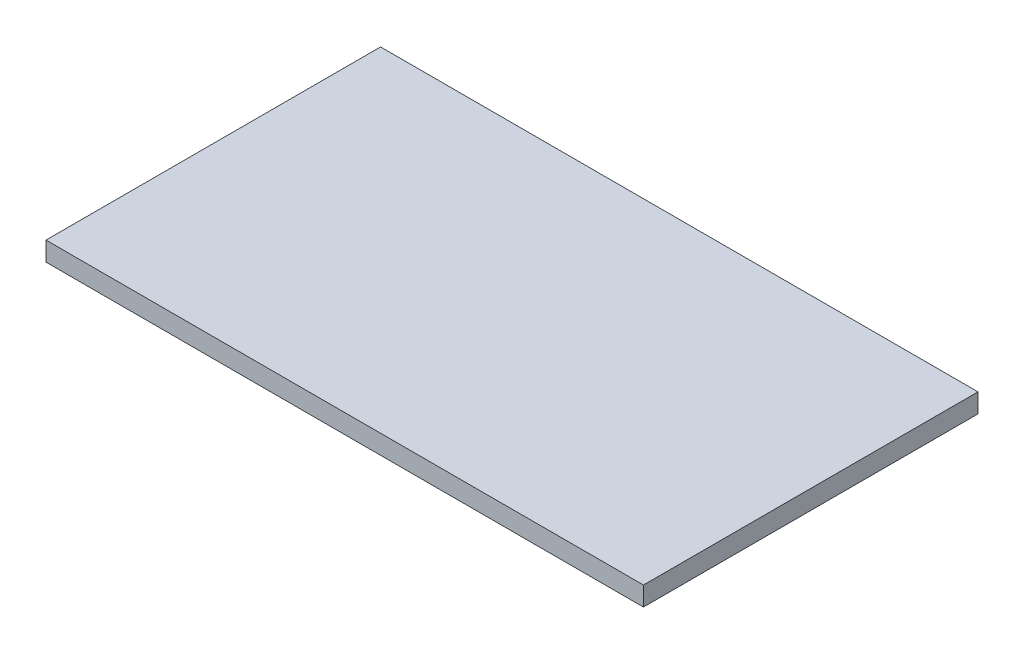
ISO-10303-21;
HEADER;
FILE_DESCRIPTION(('STEP AP214'),'2;1');
FILE_NAME('part.step','',(''),(''),'','','');
FILE_SCHEMA(('AUTOMOTIVE_DESIGN { 1 0 10303 214 1 1 1 1 }'));
ENDSEC;
DATA;
#1=APPLICATION_CONTEXT('core data for automotive mechanical design processes');
#2=APPLICATION_PROTOCOL_DEFINITION('international standard','automotive_design',2000,#1);
#3=PRODUCT_CONTEXT('',#1,'mechanical');
#4=PRODUCT('Part','Part','',(#3));
#5=PRODUCT_RELATED_PRODUCT_CATEGORY('part','',(#4));
#6=PRODUCT_DEFINITION_FORMATION('','',#4);
#7=PRODUCT_DEFINITION_CONTEXT('part definition',#1,'design');
#8=PRODUCT_DEFINITION('design','',#6,#7);
#9=PRODUCT_DEFINITION_SHAPE('','',#8);
#10=(LENGTH_UNIT() NAMED_UNIT(*) SI_UNIT(.MILLI.,.METRE.));
#11=(NAMED_UNIT(*) PLANE_ANGLE_UNIT() SI_UNIT($,.RADIAN.));
#12=(NAMED_UNIT(*) SI_UNIT($,.STERADIAN.) SOLID_ANGLE_UNIT());
#13=UNCERTAINTY_MEASURE_WITH_UNIT(LENGTH_MEASURE(1.E-05),#10,'distance_accuracy_value','');
#14=(GEOMETRIC_REPRESENTATION_CONTEXT(3) GLOBAL_UNCERTAINTY_ASSIGNED_CONTEXT((#13)) GLOBAL_UNIT_ASSIGNED_CONTEXT((#10,
#11,#12)) REPRESENTATION_CONTEXT('',''));
#15=CARTESIAN_POINT('',(0.,0.,0.));
#16=DIRECTION('',(0.,0.,1.));
#17=DIRECTION('',(1.,0.,0.));
#18=AXIS2_PLACEMENT_3D('',#15,#16,#17);
#19=CARTESIAN_POINT('',(-25.,1.6,-14.));
#20=DIRECTION('',(1.,0.,0.));
#21=DIRECTION('',(0.,0.,-1.));
#22=AXIS2_PLACEMENT_3D('',#19,#20,#21);
#23=PLANE('',#22);
#24=DIRECTION('',(0.,0.,1.));
#25=VECTOR('',#24,1.);
#26=CARTESIAN_POINT('',(-25.,0.,-14.));
#27=LINE('',#26,#25);
#28=CARTESIAN_POINT('',(-25.,0.,-14.));
#29=VERTEX_POINT('',#28);
#30=CARTESIAN_POINT('',(-25.,0.,14.));
#31=VERTEX_POINT('',#30);
#32=EDGE_CURVE('E410',#29,#31,#27,.T.);
#33=ORIENTED_EDGE('',*,*,#32,.T.);
#34=DIRECTION('',(0.,-1.,0.));
#35=VECTOR('',#34,1.);
#36=CARTESIAN_POINT('',(-25.,1.6,14.));
#37=LINE('',#36,#35);
#38=CARTESIAN_POINT('',(-25.,1.6,14.));
#39=VERTEX_POINT('',#38);
#40=EDGE_CURVE('E11',#39,#31,#37,.T.);
#41=ORIENTED_EDGE('',*,*,#40,.F.);
#42=DIRECTION('',(0.,0.,1.));
#43=VECTOR('',#42,1.);
#44=CARTESIAN_POINT('',(-25.,1.6,-14.));
#45=LINE('',#44,#43);
#46=CARTESIAN_POINT('',(-25.,1.6,-14.));
#47=VERTEX_POINT('',#46);
#48=EDGE_CURVE('E428',#47,#39,#45,.T.);
#49=ORIENTED_EDGE('',*,*,#48,.F.);
#50=DIRECTION('',(0.,-1.,0.));
#51=VECTOR('',#50,1.);
#52=CARTESIAN_POINT('',(-25.,1.6,-14.));
#53=LINE('',#52,#51);
#54=EDGE_CURVE('E422',#47,#29,#53,.T.);
#55=ORIENTED_EDGE('',*,*,#54,.T.);
#56=EDGE_LOOP('',(#33,#41,#49,#55));
#57=FACE_BOUND('',#56,.T.);
#58=ADVANCED_FACE('F366',(#57),#23,.F.);
#59=CARTESIAN_POINT('',(-25.,1.6,14.));
#60=DIRECTION('',(0.,0.,-1.));
#61=DIRECTION('',(-1.,0.,0.));
#62=AXIS2_PLACEMENT_3D('',#59,#60,#61);
#63=PLANE('',#62);
#64=DIRECTION('',(1.,0.,0.));
#65=VECTOR('',#64,1.);
#66=CARTESIAN_POINT('',(-25.,0.,14.));
#67=LINE('',#66,#65);
#68=CARTESIAN_POINT('',(25.,0.,14.));
#69=VERTEX_POINT('',#68);
#70=EDGE_CURVE('E406',#31,#69,#67,.T.);
#71=ORIENTED_EDGE('',*,*,#70,.T.);
#72=DIRECTION('',(0.,-1.,0.));
#73=VECTOR('',#72,1.);
#74=CARTESIAN_POINT('',(25.,1.6,14.));
#75=LINE('',#74,#73);
#76=CARTESIAN_POINT('',(25.,1.6,14.));
#77=VERTEX_POINT('',#76);
#78=EDGE_CURVE('E373',#77,#69,#75,.T.);
#79=ORIENTED_EDGE('',*,*,#78,.F.);
#80=DIRECTION('',(1.,0.,0.));
#81=VECTOR('',#80,1.);
#82=CARTESIAN_POINT('',(-25.,1.6,14.));
#83=LINE('',#82,#81);
#84=EDGE_CURVE('E418',#39,#77,#83,.T.);
#85=ORIENTED_EDGE('',*,*,#84,.F.);
#86=ORIENTED_EDGE('',*,*,#40,.T.);
#87=EDGE_LOOP('',(#71,#79,#85,#86));
#88=FACE_BOUND('',#87,.T.);
#89=ADVANCED_FACE('F417',(#88),#63,.F.);
#90=CARTESIAN_POINT('',(25.,1.6,-14.));
#91=DIRECTION('',(-1.,0.,0.));
#92=DIRECTION('',(0.,0.,1.));
#93=AXIS2_PLACEMENT_3D('',#90,#91,#92);
#94=PLANE('',#93);
#95=DIRECTION('',(0.,0.,-1.));
#96=VECTOR('',#95,1.);
#97=CARTESIAN_POINT('',(25.,0.,-14.));
#98=LINE('',#97,#96);
#99=CARTESIAN_POINT('',(25.,0.,-14.));
#100=VERTEX_POINT('',#99);
#101=EDGE_CURVE('E411',#69,#100,#98,.T.);
#102=ORIENTED_EDGE('',*,*,#101,.T.);
#103=DIRECTION('',(0.,-1.,0.));
#104=VECTOR('',#103,1.);
#105=CARTESIAN_POINT('',(25.,1.6,-14.));
#106=LINE('',#105,#104);
#107=CARTESIAN_POINT('',(25.,1.6,-14.));
#108=VERTEX_POINT('',#107);
#109=EDGE_CURVE('E434',#108,#100,#106,.T.);
#110=ORIENTED_EDGE('',*,*,#109,.F.);
#111=DIRECTION('',(0.,0.,-1.));
#112=VECTOR('',#111,1.);
#113=CARTESIAN_POINT('',(25.,1.6,-14.));
#114=LINE('',#113,#112);
#115=EDGE_CURVE('E385',#77,#108,#114,.T.);
#116=ORIENTED_EDGE('',*,*,#115,.F.);
#117=ORIENTED_EDGE('',*,*,#78,.T.);
#118=EDGE_LOOP('',(#102,#110,#116,#117));
#119=FACE_BOUND('',#118,.T.);
#120=ADVANCED_FACE('F437',(#119),#94,.F.);
#121=CARTESIAN_POINT('',(-25.,1.6,-14.));
#122=DIRECTION('',(0.,0.,1.));
#123=DIRECTION('',(1.,0.,0.));
#124=AXIS2_PLACEMENT_3D('',#121,#122,#123);
#125=PLANE('',#124);
#126=DIRECTION('',(-1.,0.,0.));
#127=VECTOR('',#126,1.);
#128=CARTESIAN_POINT('',(-25.,0.,-14.));
#129=LINE('',#128,#127);
#130=EDGE_CURVE('E426',#100,#29,#129,.T.);
#131=ORIENTED_EDGE('',*,*,#130,.T.);
#132=ORIENTED_EDGE('',*,*,#54,.F.);
#133=DIRECTION('',(-1.,0.,0.));
#134=VECTOR('',#133,1.);
#135=CARTESIAN_POINT('',(-25.,1.6,-14.));
#136=LINE('',#135,#134);
#137=EDGE_CURVE('E380',#108,#47,#136,.T.);
#138=ORIENTED_EDGE('',*,*,#137,.F.);
#139=ORIENTED_EDGE('',*,*,#109,.T.);
#140=EDGE_LOOP('',(#131,#132,#138,#139));
#141=FACE_BOUND('',#140,.T.);
#142=ADVANCED_FACE('F439',(#141),#125,.F.);
#143=CARTESIAN_POINT('',(-25.,1.6,14.));
#144=DIRECTION('',(0.,1.,0.));
#145=DIRECTION('',(0.,0.,1.));
#146=AXIS2_PLACEMENT_3D('',#143,#144,#145);
#147=PLANE('',#146);
#148=ORIENTED_EDGE('',*,*,#48,.T.);
#149=ORIENTED_EDGE('',*,*,#84,.T.);
#150=ORIENTED_EDGE('',*,*,#115,.T.);
#151=ORIENTED_EDGE('',*,*,#137,.T.);
#152=EDGE_LOOP('',(#148,#149,#150,#151));
#153=FACE_BOUND('',#152,.T.);
#154=ADVANCED_FACE('F440',(#153),#147,.T.);
#155=CARTESIAN_POINT('',(-25.,0.,14.));
#156=DIRECTION('',(0.,1.,0.));
#157=DIRECTION('',(0.,0.,1.));
#158=AXIS2_PLACEMENT_3D('',#155,#156,#157);
#159=PLANE('',#158);
#160=ORIENTED_EDGE('',*,*,#32,.F.);
#161=ORIENTED_EDGE('',*,*,#130,.F.);
#162=ORIENTED_EDGE('',*,*,#101,.F.);
#163=ORIENTED_EDGE('',*,*,#70,.F.);
#164=EDGE_LOOP('',(#160,#161,#162,#163));
#165=FACE_BOUND('',#164,.T.);
#166=ADVANCED_FACE('F407',(#165),#159,.F.);
#167=CLOSED_SHELL('',(#58,#89,#120,#142,#154,#166));
#168=MANIFOLD_SOLID_BREP('B2',#167);
#169=ADVANCED_BREP_SHAPE_REPRESENTATION('',(#18,#168),#14);
#170=SHAPE_DEFINITION_REPRESENTATION(#9,#169);
ENDSEC;
END-ISO-10303-21;
